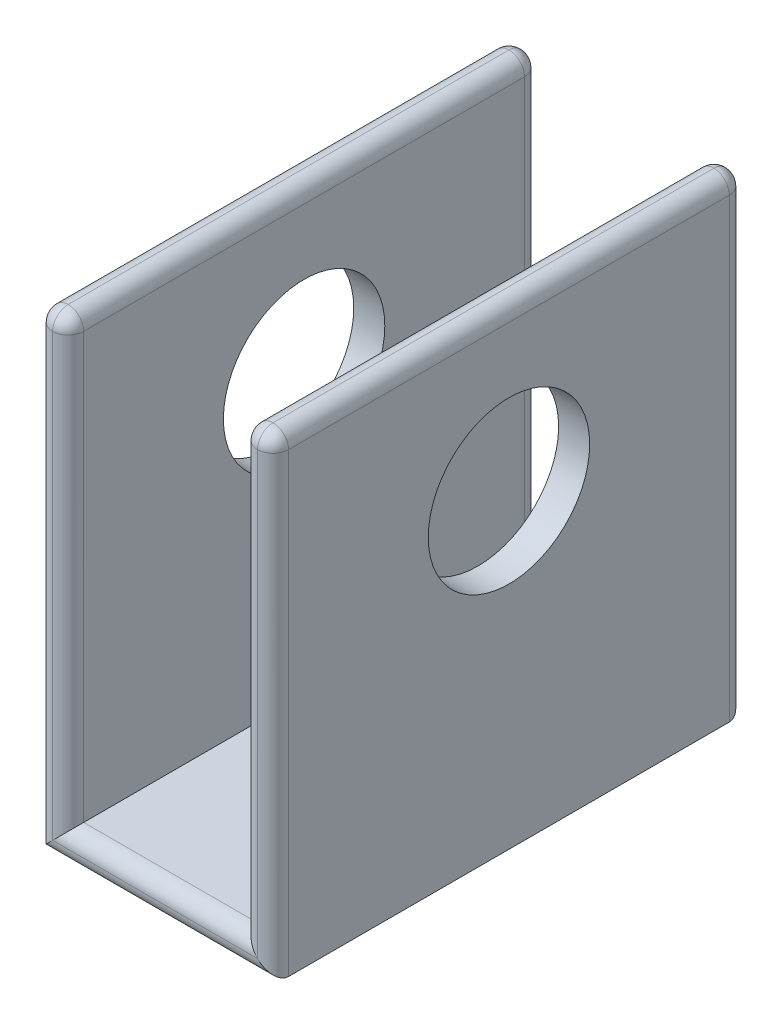
ISO-10303-21;
HEADER;
FILE_DESCRIPTION(('STEP AP214'),'2;1');
FILE_NAME('part.step','',(''),(''),'','','');
FILE_SCHEMA(('AUTOMOTIVE_DESIGN { 1 0 10303 214 1 1 1 1 }'));
ENDSEC;
DATA;
#1=APPLICATION_CONTEXT('core data for automotive mechanical design processes');
#2=APPLICATION_PROTOCOL_DEFINITION('international standard','automotive_design',2000,#1);
#3=PRODUCT_CONTEXT('',#1,'mechanical');
#4=PRODUCT('Part','Part','',(#3));
#5=PRODUCT_RELATED_PRODUCT_CATEGORY('part','',(#4));
#6=PRODUCT_DEFINITION_FORMATION('','',#4);
#7=PRODUCT_DEFINITION_CONTEXT('part definition',#1,'design');
#8=PRODUCT_DEFINITION('design','',#6,#7);
#9=PRODUCT_DEFINITION_SHAPE('','',#8);
#10=(LENGTH_UNIT() NAMED_UNIT(*) SI_UNIT(.MILLI.,.METRE.));
#11=(NAMED_UNIT(*) PLANE_ANGLE_UNIT() SI_UNIT($,.RADIAN.));
#12=(NAMED_UNIT(*) SI_UNIT($,.STERADIAN.) SOLID_ANGLE_UNIT());
#13=UNCERTAINTY_MEASURE_WITH_UNIT(LENGTH_MEASURE(1.E-05),#10,'distance_accuracy_value','');
#14=(GEOMETRIC_REPRESENTATION_CONTEXT(3) GLOBAL_UNCERTAINTY_ASSIGNED_CONTEXT((#13)) GLOBAL_UNIT_ASSIGNED_CONTEXT((#10,
#11,#12)) REPRESENTATION_CONTEXT('',''));
#15=CARTESIAN_POINT('',(0.,0.,0.));
#16=DIRECTION('',(0.,0.,1.));
#17=DIRECTION('',(1.,0.,0.));
#18=AXIS2_PLACEMENT_3D('',#15,#16,#17);
#19=CARTESIAN_POINT('',(8.25,36.75,38.));
#20=DIRECTION('',(0.,0.,-1.));
#21=DIRECTION('',(-1.,0.,0.));
#22=AXIS2_PLACEMENT_3D('',#19,#20,#21);
#23=CYLINDRICAL_SURFACE('',#22,1.25);
#24=DIRECTION('',(0.,0.,-1.));
#25=VECTOR('',#24,1.);
#26=CARTESIAN_POINT('',(8.25000000000001,38.,38.));
#27=LINE('',#26,#25);
#28=CARTESIAN_POINT('',(8.25000000000001,38.,36.75));
#29=VERTEX_POINT('',#28);
#30=CARTESIAN_POINT('',(8.25000000000001,38.,1.25));
#31=VERTEX_POINT('',#30);
#32=EDGE_CURVE('E282',#29,#31,#27,.T.);
#33=ORIENTED_EDGE('',*,*,#32,.T.);
#34=CARTESIAN_POINT('',(8.25,36.75,1.25));
#35=DIRECTION('',(0.,0.,-1.));
#36=DIRECTION('',(-1.,0.,0.));
#37=AXIS2_PLACEMENT_3D('',#34,#35,#36);
#38=CIRCLE('',#37,1.25);
#39=CARTESIAN_POINT('',(7.,36.75,1.25));
#40=VERTEX_POINT('',#39);
#41=EDGE_CURVE('E307',#31,#40,#38,.F.);
#42=ORIENTED_EDGE('',*,*,#41,.T.);
#43=DIRECTION('',(0.,0.,-1.));
#44=VECTOR('',#43,1.);
#45=CARTESIAN_POINT('',(7.,36.75,38.));
#46=LINE('',#45,#44);
#47=CARTESIAN_POINT('',(7.,36.75,36.75));
#48=VERTEX_POINT('',#47);
#49=EDGE_CURVE('E283',#48,#40,#46,.T.);
#50=ORIENTED_EDGE('',*,*,#49,.F.);
#51=CARTESIAN_POINT('',(8.25,36.75,36.75));
#52=DIRECTION('',(0.,0.,-1.));
#53=DIRECTION('',(-1.,0.,0.));
#54=AXIS2_PLACEMENT_3D('',#51,#52,#53);
#55=CIRCLE('',#54,1.25);
#56=EDGE_CURVE('E286',#48,#29,#55,.T.);
#57=ORIENTED_EDGE('',*,*,#56,.T.);
#58=EDGE_LOOP('',(#33,#42,#50,#57));
#59=FACE_BOUND('',#58,.T.);
#60=ADVANCED_FACE('F45',(#59),#23,.T.);
#61=CARTESIAN_POINT('',(7.,2.5,38.));
#62=DIRECTION('',(-1.,0.,0.));
#63=DIRECTION('',(0.,-1.,0.));
#64=AXIS2_PLACEMENT_3D('',#61,#62,#63);
#65=PLANE('',#64);
#66=CARTESIAN_POINT('',(7.,25.,19.));
#67=DIRECTION('',(-1.,0.,0.));
#68=DIRECTION('',(0.,-1.,0.));
#69=AXIS2_PLACEMENT_3D('',#66,#67,#68);
#70=CIRCLE('',#69,6.5);
#71=CARTESIAN_POINT('',(7.,18.5,19.));
#72=VERTEX_POINT('',#71);
#73=EDGE_CURVE('E278',#72,#72,#70,.T.);
#74=ORIENTED_EDGE('',*,*,#73,.F.);
#75=EDGE_LOOP('',(#74));
#76=FACE_BOUND('',#75,.T.);
#77=DIRECTION('',(0.,0.,-1.));
#78=VECTOR('',#77,1.);
#79=CARTESIAN_POINT('',(7.,2.5,38.));
#80=LINE('',#79,#78);
#81=CARTESIAN_POINT('',(7.,2.5,36.75));
#82=VERTEX_POINT('',#81);
#83=CARTESIAN_POINT('',(7.,2.5,1.25));
#84=VERTEX_POINT('',#83);
#85=EDGE_CURVE('E161',#82,#84,#80,.T.);
#86=ORIENTED_EDGE('',*,*,#85,.F.);
#87=DIRECTION('',(0.,1.,0.));
#88=VECTOR('',#87,1.);
#89=CARTESIAN_POINT('',(7.,36.75,36.75));
#90=LINE('',#89,#88);
#91=EDGE_CURVE('E11',#82,#48,#90,.T.);
#92=ORIENTED_EDGE('',*,*,#91,.T.);
#93=ORIENTED_EDGE('',*,*,#49,.T.);
#94=DIRECTION('',(0.,1.,0.));
#95=VECTOR('',#94,1.);
#96=CARTESIAN_POINT('',(7.,2.5,1.25));
#97=LINE('',#96,#95);
#98=EDGE_CURVE('E56',#40,#84,#97,.F.);
#99=ORIENTED_EDGE('',*,*,#98,.T.);
#100=EDGE_LOOP('',(#86,#92,#93,#99));
#101=FACE_BOUND('',#100,.T.);
#102=ADVANCED_FACE('F403',(#76,#101),#65,.T.);
#103=CARTESIAN_POINT('',(-7.,2.5,38.));
#104=DIRECTION('',(0.,1.,0.));
#105=DIRECTION('',(0.,0.,1.));
#106=AXIS2_PLACEMENT_3D('',#103,#104,#105);
#107=PLANE('',#106);
#108=DIRECTION('',(0.,0.,-1.));
#109=VECTOR('',#108,1.);
#110=CARTESIAN_POINT('',(-7.,2.5,38.));
#111=LINE('',#110,#109);
#112=CARTESIAN_POINT('',(-7.,2.5,36.75));
#113=VERTEX_POINT('',#112);
#114=CARTESIAN_POINT('',(-7.,2.5,1.25));
#115=VERTEX_POINT('',#114);
#116=EDGE_CURVE('E160',#113,#115,#111,.T.);
#117=ORIENTED_EDGE('',*,*,#116,.F.);
#118=DIRECTION('',(1.,0.,0.));
#119=VECTOR('',#118,1.);
#120=CARTESIAN_POINT('',(7.,2.5,36.75));
#121=LINE('',#120,#119);
#122=EDGE_CURVE('E167',#113,#82,#121,.T.);
#123=ORIENTED_EDGE('',*,*,#122,.T.);
#124=ORIENTED_EDGE('',*,*,#85,.T.);
#125=DIRECTION('',(1.,0.,0.));
#126=VECTOR('',#125,1.);
#127=CARTESIAN_POINT('',(-7.,2.5,1.25));
#128=LINE('',#127,#126);
#129=EDGE_CURVE('E157',#84,#115,#128,.F.);
#130=ORIENTED_EDGE('',*,*,#129,.T.);
#131=EDGE_LOOP('',(#117,#123,#124,#130));
#132=FACE_BOUND('',#131,.T.);
#133=ADVANCED_FACE('F159',(#132),#107,.T.);
#134=CARTESIAN_POINT('',(-7.,2.5,38.));
#135=DIRECTION('',(-1.,0.,0.));
#136=DIRECTION('',(0.,0.,1.));
#137=AXIS2_PLACEMENT_3D('',#134,#135,#136);
#138=PLANE('',#137);
#139=CARTESIAN_POINT('',(-7.,25.,19.));
#140=DIRECTION('',(-1.,0.,0.));
#141=DIRECTION('',(0.,0.,1.));
#142=AXIS2_PLACEMENT_3D('',#139,#140,#141);
#143=CIRCLE('',#142,6.5);
#144=CARTESIAN_POINT('',(-7.,25.,25.5));
#145=VERTEX_POINT('',#144);
#146=EDGE_CURVE('E272',#145,#145,#143,.T.);
#147=ORIENTED_EDGE('',*,*,#146,.T.);
#148=EDGE_LOOP('',(#147));
#149=FACE_BOUND('',#148,.T.);
#150=DIRECTION('',(0.,0.,-1.));
#151=VECTOR('',#150,1.);
#152=CARTESIAN_POINT('',(-7.,36.75,38.));
#153=LINE('',#152,#151);
#154=CARTESIAN_POINT('',(-7.,36.75,36.75));
#155=VERTEX_POINT('',#154);
#156=CARTESIAN_POINT('',(-7.,36.75,1.25));
#157=VERTEX_POINT('',#156);
#158=EDGE_CURVE('E178',#155,#157,#153,.T.);
#159=ORIENTED_EDGE('',*,*,#158,.F.);
#160=DIRECTION('',(0.,1.,0.));
#161=VECTOR('',#160,1.);
#162=CARTESIAN_POINT('',(-7.,2.5,36.75));
#163=LINE('',#162,#161);
#164=EDGE_CURVE('E168',#155,#113,#163,.F.);
#165=ORIENTED_EDGE('',*,*,#164,.T.);
#166=ORIENTED_EDGE('',*,*,#116,.T.);
#167=DIRECTION('',(0.,1.,0.));
#168=VECTOR('',#167,1.);
#169=CARTESIAN_POINT('',(-7.,36.75,1.25));
#170=LINE('',#169,#168);
#171=EDGE_CURVE('E174',#115,#157,#170,.T.);
#172=ORIENTED_EDGE('',*,*,#171,.T.);
#173=EDGE_LOOP('',(#159,#165,#166,#172));
#174=FACE_BOUND('',#173,.T.);
#175=ADVANCED_FACE('F173',(#149,#174),#138,.F.);
#176=CARTESIAN_POINT('',(-8.25,36.75,38.));
#177=DIRECTION('',(0.,0.,-1.));
#178=DIRECTION('',(-1.,0.,0.));
#179=AXIS2_PLACEMENT_3D('',#176,#177,#178);
#180=CYLINDRICAL_SURFACE('',#179,1.25);
#181=ORIENTED_EDGE('',*,*,#158,.T.);
#182=CARTESIAN_POINT('',(-8.25,36.75,1.25));
#183=DIRECTION('',(0.,0.,-1.));
#184=DIRECTION('',(-1.,0.,0.));
#185=AXIS2_PLACEMENT_3D('',#182,#183,#184);
#186=CIRCLE('',#185,1.25);
#187=CARTESIAN_POINT('',(-8.25000000000001,38.,1.25));
#188=VERTEX_POINT('',#187);
#189=EDGE_CURVE('E314',#157,#188,#186,.F.);
#190=ORIENTED_EDGE('',*,*,#189,.T.);
#191=DIRECTION('',(0.,0.,-1.));
#192=VECTOR('',#191,1.);
#193=CARTESIAN_POINT('',(-8.25000000000001,38.,38.));
#194=LINE('',#193,#192);
#195=CARTESIAN_POINT('',(-8.25000000000001,38.,36.75));
#196=VERTEX_POINT('',#195);
#197=EDGE_CURVE('E291',#196,#188,#194,.T.);
#198=ORIENTED_EDGE('',*,*,#197,.F.);
#199=CARTESIAN_POINT('',(-8.25,36.75,36.75));
#200=DIRECTION('',(0.,0.,-1.));
#201=DIRECTION('',(-1.,0.,0.));
#202=AXIS2_PLACEMENT_3D('',#199,#200,#201);
#203=CIRCLE('',#202,1.25);
#204=EDGE_CURVE('E311',#196,#155,#203,.T.);
#205=ORIENTED_EDGE('',*,*,#204,.T.);
#206=EDGE_LOOP('',(#181,#190,#198,#205));
#207=FACE_BOUND('',#206,.T.);
#208=ADVANCED_FACE('F396',(#207),#180,.T.);
#209=CARTESIAN_POINT('',(-9.5,0.,38.));
#210=DIRECTION('',(-1.,0.,0.));
#211=DIRECTION('',(0.,0.,1.));
#212=AXIS2_PLACEMENT_3D('',#209,#210,#211);
#213=PLANE('',#212);
#214=DIRECTION('',(0.,0.,-1.));
#215=VECTOR('',#214,1.);
#216=CARTESIAN_POINT('',(-9.5,0.,38.));
#217=LINE('',#216,#215);
#218=CARTESIAN_POINT('',(-9.5,0.,36.75));
#219=VERTEX_POINT('',#218);
#220=CARTESIAN_POINT('',(-9.5,0.,1.25));
#221=VERTEX_POINT('',#220);
#222=EDGE_CURVE('E295',#219,#221,#217,.T.);
#223=ORIENTED_EDGE('',*,*,#222,.F.);
#224=DIRECTION('',(0.,1.,0.));
#225=VECTOR('',#224,1.);
#226=CARTESIAN_POINT('',(-9.5,38.,36.75));
#227=LINE('',#226,#225);
#228=CARTESIAN_POINT('',(-9.5,36.75,36.75));
#229=VERTEX_POINT('',#228);
#230=EDGE_CURVE('E190',#219,#229,#227,.T.);
#231=ORIENTED_EDGE('',*,*,#230,.T.);
#232=DIRECTION('',(0.,0.,-1.));
#233=VECTOR('',#232,1.);
#234=CARTESIAN_POINT('',(-9.5,36.75,38.));
#235=LINE('',#234,#233);
#236=CARTESIAN_POINT('',(-9.5,36.75,1.25));
#237=VERTEX_POINT('',#236);
#238=EDGE_CURVE('E333',#229,#237,#235,.T.);
#239=ORIENTED_EDGE('',*,*,#238,.T.);
#240=DIRECTION('',(0.,1.,0.));
#241=VECTOR('',#240,1.);
#242=CARTESIAN_POINT('',(-9.5,0.,1.25));
#243=LINE('',#242,#241);
#244=EDGE_CURVE('E336',#237,#221,#243,.F.);
#245=ORIENTED_EDGE('',*,*,#244,.T.);
#246=EDGE_LOOP('',(#223,#231,#239,#245));
#247=FACE_BOUND('',#246,.T.);
#248=CARTESIAN_POINT('',(-9.5,25.,19.));
#249=DIRECTION('',(1.,0.,0.));
#250=DIRECTION('',(0.,0.,-1.));
#251=AXIS2_PLACEMENT_3D('',#248,#249,#250);
#252=CIRCLE('',#251,6.5);
#253=CARTESIAN_POINT('',(-9.5,25.,12.5));
#254=VERTEX_POINT('',#253);
#255=EDGE_CURVE('E266',#254,#254,#252,.T.);
#256=ORIENTED_EDGE('',*,*,#255,.T.);
#257=EDGE_LOOP('',(#256));
#258=FACE_BOUND('',#257,.T.);
#259=ADVANCED_FACE('F423',(#247,#258),#213,.T.);
#260=CARTESIAN_POINT('',(-9.5,0.,38.));
#261=DIRECTION('',(0.,1.,0.));
#262=DIRECTION('',(0.,0.,1.));
#263=AXIS2_PLACEMENT_3D('',#260,#261,#262);
#264=PLANE('',#263);
#265=DIRECTION('',(0.,0.,-1.));
#266=VECTOR('',#265,1.);
#267=CARTESIAN_POINT('',(9.5,0.,38.));
#268=LINE('',#267,#266);
#269=CARTESIAN_POINT('',(9.5,0.,36.75));
#270=VERTEX_POINT('',#269);
#271=CARTESIAN_POINT('',(9.5,0.,1.25));
#272=VERTEX_POINT('',#271);
#273=EDGE_CURVE('E299',#270,#272,#268,.T.);
#274=ORIENTED_EDGE('',*,*,#273,.F.);
#275=DIRECTION('',(1.,0.,0.));
#276=VECTOR('',#275,1.);
#277=CARTESIAN_POINT('',(-9.5,0.,36.75));
#278=LINE('',#277,#276);
#279=EDGE_CURVE('E330',#270,#219,#278,.F.);
#280=ORIENTED_EDGE('',*,*,#279,.T.);
#281=ORIENTED_EDGE('',*,*,#222,.T.);
#282=DIRECTION('',(1.,0.,0.));
#283=VECTOR('',#282,1.);
#284=CARTESIAN_POINT('',(9.5,0.,1.25));
#285=LINE('',#284,#283);
#286=EDGE_CURVE('E327',#221,#272,#285,.T.);
#287=ORIENTED_EDGE('',*,*,#286,.T.);
#288=EDGE_LOOP('',(#274,#280,#281,#287));
#289=FACE_BOUND('',#288,.T.);
#290=ADVANCED_FACE('F426',(#289),#264,.F.);
#291=CARTESIAN_POINT('',(9.5,0.,38.));
#292=DIRECTION('',(-1.,0.,0.));
#293=DIRECTION('',(0.,0.,1.));
#294=AXIS2_PLACEMENT_3D('',#291,#292,#293);
#295=PLANE('',#294);
#296=CARTESIAN_POINT('',(9.5,25.,19.));
#297=DIRECTION('',(1.,0.,0.));
#298=DIRECTION('',(0.,0.,-1.));
#299=AXIS2_PLACEMENT_3D('',#296,#297,#298);
#300=CIRCLE('',#299,6.5);
#301=CARTESIAN_POINT('',(9.5,25.,12.5));
#302=VERTEX_POINT('',#301);
#303=EDGE_CURVE('E261',#302,#302,#300,.T.);
#304=ORIENTED_EDGE('',*,*,#303,.F.);
#305=EDGE_LOOP('',(#304));
#306=FACE_BOUND('',#305,.T.);
#307=DIRECTION('',(0.,0.,-1.));
#308=VECTOR('',#307,1.);
#309=CARTESIAN_POINT('',(9.5,36.75,38.));
#310=LINE('',#309,#308);
#311=CARTESIAN_POINT('',(9.5,36.75,1.25));
#312=VERTEX_POINT('',#311);
#313=CARTESIAN_POINT('',(9.5,36.75,36.75));
#314=VERTEX_POINT('',#313);
#315=EDGE_CURVE('E317',#312,#314,#310,.F.);
#316=ORIENTED_EDGE('',*,*,#315,.T.);
#317=DIRECTION('',(0.,1.,0.));
#318=VECTOR('',#317,1.);
#319=CARTESIAN_POINT('',(9.5,0.,36.75));
#320=LINE('',#319,#318);
#321=EDGE_CURVE('E323',#314,#270,#320,.F.);
#322=ORIENTED_EDGE('',*,*,#321,.T.);
#323=ORIENTED_EDGE('',*,*,#273,.T.);
#324=DIRECTION('',(0.,1.,0.));
#325=VECTOR('',#324,1.);
#326=CARTESIAN_POINT('',(9.5,38.,1.25));
#327=LINE('',#326,#325);
#328=EDGE_CURVE('E320',#272,#312,#327,.T.);
#329=ORIENTED_EDGE('',*,*,#328,.T.);
#330=EDGE_LOOP('',(#316,#322,#323,#329));
#331=FACE_BOUND('',#330,.T.);
#332=ADVANCED_FACE('F430',(#306,#331),#295,.F.);
#333=CARTESIAN_POINT('',(-9.5,25.,19.));
#334=DIRECTION('',(1.,0.,0.));
#335=DIRECTION('',(0.,0.,-1.));
#336=AXIS2_PLACEMENT_3D('',#333,#334,#335);
#337=CYLINDRICAL_SURFACE('',#336,6.5);
#338=ORIENTED_EDGE('',*,*,#73,.T.);
#339=EDGE_LOOP('',(#338));
#340=FACE_BOUND('',#339,.T.);
#341=ORIENTED_EDGE('',*,*,#303,.T.);
#342=EDGE_LOOP('',(#341));
#343=FACE_BOUND('',#342,.T.);
#344=ADVANCED_FACE('F416',(#340,#343),#337,.F.);
#345=ORIENTED_EDGE('',*,*,#255,.F.);
#346=EDGE_LOOP('',(#345));
#347=FACE_BOUND('',#346,.T.);
#348=ORIENTED_EDGE('',*,*,#146,.F.);
#349=EDGE_LOOP('',(#348));
#350=FACE_BOUND('',#349,.T.);
#351=ADVANCED_FACE('F503',(#347,#350),#337,.F.);
#352=CARTESIAN_POINT('',(-8.25,36.75,36.75));
#353=DIRECTION('',(0.,0.,-1.));
#354=DIRECTION('',(-1.,0.,0.));
#355=AXIS2_PLACEMENT_3D('',#352,#353,#354);
#356=SPHERICAL_SURFACE('',#355,1.25);
#357=ORIENTED_EDGE('',*,*,#204,.F.);
#358=CARTESIAN_POINT('',(-8.25,36.75,36.75));
#359=DIRECTION('',(-1.,0.,0.));
#360=DIRECTION('',(0.,0.,1.));
#361=AXIS2_PLACEMENT_3D('',#358,#359,#360);
#362=CIRCLE('',#361,1.25);
#363=CARTESIAN_POINT('',(-8.25,36.75,38.));
#364=VERTEX_POINT('',#363);
#365=EDGE_CURVE('E49',#364,#196,#362,.T.);
#366=ORIENTED_EDGE('',*,*,#365,.F.);
#367=CARTESIAN_POINT('',(-8.25,36.75,36.75));
#368=DIRECTION('',(0.,-1.,0.));
#369=DIRECTION('',(1.,0.,0.));
#370=AXIS2_PLACEMENT_3D('',#367,#368,#369);
#371=CIRCLE('',#370,1.25);
#372=EDGE_CURVE('E257',#155,#364,#371,.T.);
#373=ORIENTED_EDGE('',*,*,#372,.F.);
#374=EDGE_LOOP('',(#357,#366,#373));
#375=FACE_BOUND('',#374,.T.);
#376=ADVANCED_FACE('F47',(#375),#356,.T.);
#377=CARTESIAN_POINT('',(-8.25,36.75,36.75));
#378=DIRECTION('',(0.,1.,0.));
#379=DIRECTION('',(0.,0.,1.));
#380=AXIS2_PLACEMENT_3D('',#377,#378,#379);
#381=SPHERICAL_SURFACE('',#380,1.25);
#382=CARTESIAN_POINT('',(-8.25,36.75,36.75));
#383=DIRECTION('',(0.,1.,0.));
#384=DIRECTION('',(0.,0.,1.));
#385=AXIS2_PLACEMENT_3D('',#382,#383,#384);
#386=CIRCLE('',#385,1.25);
#387=EDGE_CURVE('E250',#364,#229,#386,.F.);
#388=ORIENTED_EDGE('',*,*,#387,.F.);
#389=ORIENTED_EDGE('',*,*,#365,.T.);
#390=CARTESIAN_POINT('',(-8.25,36.75,36.75));
#391=DIRECTION('',(0.,0.,1.));
#392=DIRECTION('',(1.,0.,0.));
#393=AXIS2_PLACEMENT_3D('',#390,#391,#392);
#394=CIRCLE('',#393,1.25);
#395=EDGE_CURVE('E254',#229,#196,#394,.F.);
#396=ORIENTED_EDGE('',*,*,#395,.F.);
#397=EDGE_LOOP('',(#388,#389,#396));
#398=FACE_BOUND('',#397,.T.);
#399=ADVANCED_FACE('F498',(#398),#381,.T.);
#400=CARTESIAN_POINT('',(-8.25,36.75,36.75));
#401=DIRECTION('',(0.,1.,0.));
#402=DIRECTION('',(0.,0.,1.));
#403=AXIS2_PLACEMENT_3D('',#400,#401,#402);
#404=CYLINDRICAL_SURFACE('',#403,1.25);
#405=ORIENTED_EDGE('',*,*,#164,.F.);
#406=ORIENTED_EDGE('',*,*,#372,.T.);
#407=DIRECTION('',(0.,1.,0.));
#408=VECTOR('',#407,1.);
#409=CARTESIAN_POINT('',(-8.25,36.75,38.));
#410=LINE('',#409,#408);
#411=CARTESIAN_POINT('',(-8.25,1.25,38.));
#412=VERTEX_POINT('',#411);
#413=EDGE_CURVE('E94',#412,#364,#410,.T.);
#414=ORIENTED_EDGE('',*,*,#413,.F.);
#415=CARTESIAN_POINT('',(-8.25,1.25,36.75));
#416=DIRECTION('',(-0.707106781186547,0.707106781186547,0.));
#417=DIRECTION('',(0.707106781186547,0.707106781186547,0.));
#418=AXIS2_PLACEMENT_3D('',#415,#416,#417);
#419=ELLIPSE('',#418,1.76776695296637,1.25);
#420=EDGE_CURVE('E245',#113,#412,#419,.F.);
#421=ORIENTED_EDGE('',*,*,#420,.F.);
#422=EDGE_LOOP('',(#405,#406,#414,#421));
#423=FACE_BOUND('',#422,.T.);
#424=ADVANCED_FACE('F397',(#423),#404,.T.);
#425=CARTESIAN_POINT('',(-8.25,36.75,38.));
#426=DIRECTION('',(0.,0.,-1.));
#427=DIRECTION('',(-1.,0.,0.));
#428=AXIS2_PLACEMENT_3D('',#425,#426,#427);
#429=CYLINDRICAL_SURFACE('',#428,1.25);
#430=ORIENTED_EDGE('',*,*,#395,.T.);
#431=ORIENTED_EDGE('',*,*,#197,.T.);
#432=CARTESIAN_POINT('',(-8.25,36.75,1.25));
#433=DIRECTION('',(0.,0.,-1.));
#434=DIRECTION('',(-1.,0.,0.));
#435=AXIS2_PLACEMENT_3D('',#432,#433,#434);
#436=CIRCLE('',#435,1.25);
#437=EDGE_CURVE('E237',#237,#188,#436,.T.);
#438=ORIENTED_EDGE('',*,*,#437,.F.);
#439=ORIENTED_EDGE('',*,*,#238,.F.);
#440=EDGE_LOOP('',(#430,#431,#438,#439));
#441=FACE_BOUND('',#440,.T.);
#442=ADVANCED_FACE('F492',(#441),#429,.T.);
#443=CARTESIAN_POINT('',(-8.25,0.,36.75));
#444=DIRECTION('',(0.,-1.,0.));
#445=DIRECTION('',(0.,0.,-1.));
#446=AXIS2_PLACEMENT_3D('',#443,#444,#445);
#447=CYLINDRICAL_SURFACE('',#446,1.25);
#448=ORIENTED_EDGE('',*,*,#387,.T.);
#449=ORIENTED_EDGE('',*,*,#230,.F.);
#450=CARTESIAN_POINT('',(-8.25,1.25,36.75));
#451=DIRECTION('',(0.707106781186547,-0.707106781186547,0.));
#452=DIRECTION('',(-0.707106781186547,-0.707106781186547,0.));
#453=AXIS2_PLACEMENT_3D('',#450,#451,#452);
#454=ELLIPSE('',#453,1.76776695296637,1.25);
#455=EDGE_CURVE('E233',#412,#219,#454,.T.);
#456=ORIENTED_EDGE('',*,*,#455,.F.);
#457=ORIENTED_EDGE('',*,*,#413,.T.);
#458=EDGE_LOOP('',(#448,#449,#456,#457));
#459=FACE_BOUND('',#458,.T.);
#460=ADVANCED_FACE('F489',(#459),#447,.T.);
#461=CARTESIAN_POINT('',(-7.,1.25,36.75));
#462=DIRECTION('',(-1.,0.,0.));
#463=DIRECTION('',(0.,0.,1.));
#464=AXIS2_PLACEMENT_3D('',#461,#462,#463);
#465=CYLINDRICAL_SURFACE('',#464,1.25);
#466=ORIENTED_EDGE('',*,*,#122,.F.);
#467=ORIENTED_EDGE('',*,*,#420,.T.);
#468=DIRECTION('',(1.,0.,0.));
#469=VECTOR('',#468,1.);
#470=CARTESIAN_POINT('',(-7.,1.25,38.));
#471=LINE('',#470,#469);
#472=CARTESIAN_POINT('',(8.25,1.25,38.));
#473=VERTEX_POINT('',#472);
#474=EDGE_CURVE('E229',#473,#412,#471,.F.);
#475=ORIENTED_EDGE('',*,*,#474,.F.);
#476=CARTESIAN_POINT('',(8.25,1.25,36.75));
#477=DIRECTION('',(-0.707106781186547,-0.707106781186547,0.));
#478=DIRECTION('',(-0.707106781186547,0.707106781186547,0.));
#479=AXIS2_PLACEMENT_3D('',#476,#477,#478);
#480=ELLIPSE('',#479,1.76776695296637,1.25);
#481=EDGE_CURVE('E225',#82,#473,#480,.F.);
#482=ORIENTED_EDGE('',*,*,#481,.F.);
#483=EDGE_LOOP('',(#466,#467,#475,#482));
#484=FACE_BOUND('',#483,.T.);
#485=ADVANCED_FACE('F402',(#484),#465,.T.);
#486=CARTESIAN_POINT('',(-8.25,36.75,1.25));
#487=DIRECTION('',(0.,0.,-1.));
#488=DIRECTION('',(-1.,0.,0.));
#489=AXIS2_PLACEMENT_3D('',#486,#487,#488);
#490=SPHERICAL_SURFACE('',#489,1.25);
#491=CARTESIAN_POINT('',(-8.25000000000001,36.75,1.25));
#492=DIRECTION('',(1.,0.,0.));
#493=DIRECTION('',(0.,0.,-1.));
#494=AXIS2_PLACEMENT_3D('',#491,#492,#493);
#495=CIRCLE('',#494,1.25);
#496=CARTESIAN_POINT('',(-8.25,36.75,0.));
#497=VERTEX_POINT('',#496);
#498=EDGE_CURVE('E241',#497,#188,#495,.T.);
#499=ORIENTED_EDGE('',*,*,#498,.T.);
#500=ORIENTED_EDGE('',*,*,#189,.F.);
#501=CARTESIAN_POINT('',(-8.25,36.75,1.25));
#502=DIRECTION('',(0.,-1.,0.));
#503=DIRECTION('',(1.,0.,0.));
#504=AXIS2_PLACEMENT_3D('',#501,#502,#503);
#505=CIRCLE('',#504,1.25);
#506=EDGE_CURVE('E188',#497,#157,#505,.T.);
#507=ORIENTED_EDGE('',*,*,#506,.F.);
#508=EDGE_LOOP('',(#499,#500,#507));
#509=FACE_BOUND('',#508,.T.);
#510=ADVANCED_FACE('F394',(#509),#490,.T.);
#511=CARTESIAN_POINT('',(-8.25,36.75,1.25));
#512=DIRECTION('',(0.,1.,0.));
#513=DIRECTION('',(0.,0.,1.));
#514=AXIS2_PLACEMENT_3D('',#511,#512,#513);
#515=SPHERICAL_SURFACE('',#514,1.25);
#516=ORIENTED_EDGE('',*,*,#437,.T.);
#517=ORIENTED_EDGE('',*,*,#498,.F.);
#518=CARTESIAN_POINT('',(-8.25,36.75,1.25));
#519=DIRECTION('',(0.,1.,0.));
#520=DIRECTION('',(0.,0.,1.));
#521=AXIS2_PLACEMENT_3D('',#518,#519,#520);
#522=CIRCLE('',#521,1.25);
#523=EDGE_CURVE('E213',#237,#497,#522,.F.);
#524=ORIENTED_EDGE('',*,*,#523,.F.);
#525=EDGE_LOOP('',(#516,#517,#524));
#526=FACE_BOUND('',#525,.T.);
#527=ADVANCED_FACE('F390',(#526),#515,.T.);
#528=CARTESIAN_POINT('',(8.25,1.25,36.75));
#529=DIRECTION('',(1.,0.,0.));
#530=DIRECTION('',(0.,0.,-1.));
#531=AXIS2_PLACEMENT_3D('',#528,#529,#530);
#532=CYLINDRICAL_SURFACE('',#531,1.25);
#533=ORIENTED_EDGE('',*,*,#455,.T.);
#534=ORIENTED_EDGE('',*,*,#279,.F.);
#535=CARTESIAN_POINT('',(8.25,1.25,36.75));
#536=DIRECTION('',(0.707106781186547,0.707106781186547,0.));
#537=DIRECTION('',(0.707106781186547,-0.707106781186547,0.));
#538=AXIS2_PLACEMENT_3D('',#535,#536,#537);
#539=ELLIPSE('',#538,1.76776695296637,1.25);
#540=EDGE_CURVE('E210',#473,#270,#539,.T.);
#541=ORIENTED_EDGE('',*,*,#540,.F.);
#542=ORIENTED_EDGE('',*,*,#474,.T.);
#543=EDGE_LOOP('',(#533,#534,#541,#542));
#544=FACE_BOUND('',#543,.T.);
#545=ADVANCED_FACE('F478',(#544),#532,.T.);
#546=CARTESIAN_POINT('',(8.25,2.5,36.75));
#547=DIRECTION('',(0.,-1.,0.));
#548=DIRECTION('',(1.,0.,0.));
#549=AXIS2_PLACEMENT_3D('',#546,#547,#548);
#550=CYLINDRICAL_SURFACE('',#549,1.25);
#551=CARTESIAN_POINT('',(8.25,36.75,36.75));
#552=DIRECTION('',(0.,1.,0.));
#553=DIRECTION('',(0.,0.,1.));
#554=AXIS2_PLACEMENT_3D('',#551,#552,#553);
#555=CIRCLE('',#554,1.25);
#556=CARTESIAN_POINT('',(8.25,36.75,38.));
#557=VERTEX_POINT('',#556);
#558=EDGE_CURVE('E222',#48,#557,#555,.T.);
#559=ORIENTED_EDGE('',*,*,#558,.F.);
#560=ORIENTED_EDGE('',*,*,#91,.F.);
#561=ORIENTED_EDGE('',*,*,#481,.T.);
#562=DIRECTION('',(0.,1.,0.));
#563=VECTOR('',#562,1.);
#564=CARTESIAN_POINT('',(8.25,2.5,38.));
#565=LINE('',#564,#563);
#566=EDGE_CURVE('E201',#557,#473,#565,.F.);
#567=ORIENTED_EDGE('',*,*,#566,.F.);
#568=EDGE_LOOP('',(#559,#560,#561,#567));
#569=FACE_BOUND('',#568,.T.);
#570=ADVANCED_FACE('F474',(#569),#550,.T.);
#571=CARTESIAN_POINT('',(8.25,36.75,36.75));
#572=DIRECTION('',(0.,0.,-1.));
#573=DIRECTION('',(-1.,0.,0.));
#574=AXIS2_PLACEMENT_3D('',#571,#572,#573);
#575=SPHERICAL_SURFACE('',#574,1.25);
#576=ORIENTED_EDGE('',*,*,#56,.F.);
#577=ORIENTED_EDGE('',*,*,#558,.T.);
#578=CARTESIAN_POINT('',(8.25,36.75,36.75));
#579=DIRECTION('',(1.,0.,0.));
#580=DIRECTION('',(0.,1.,0.));
#581=AXIS2_PLACEMENT_3D('',#578,#579,#580);
#582=CIRCLE('',#581,1.25);
#583=EDGE_CURVE('E196',#29,#557,#582,.T.);
#584=ORIENTED_EDGE('',*,*,#583,.F.);
#585=EDGE_LOOP('',(#576,#577,#584));
#586=FACE_BOUND('',#585,.T.);
#587=ADVANCED_FACE('F471',(#586),#575,.T.);
#588=CARTESIAN_POINT('',(-8.25,2.5,1.25));
#589=DIRECTION('',(0.,-1.,0.));
#590=DIRECTION('',(0.,0.,-1.));
#591=AXIS2_PLACEMENT_3D('',#588,#589,#590);
#592=CYLINDRICAL_SURFACE('',#591,1.25);
#593=DIRECTION('',(0.,1.,0.));
#594=VECTOR('',#593,1.);
#595=CARTESIAN_POINT('',(-8.25,2.5,0.));
#596=LINE('',#595,#594);
#597=CARTESIAN_POINT('',(-8.25,1.25,0.));
#598=VERTEX_POINT('',#597);
#599=EDGE_CURVE('E217',#497,#598,#596,.F.);
#600=ORIENTED_EDGE('',*,*,#599,.F.);
#601=ORIENTED_EDGE('',*,*,#506,.T.);
#602=ORIENTED_EDGE('',*,*,#171,.F.);
#603=CARTESIAN_POINT('',(-8.25,1.25,1.25));
#604=DIRECTION('',(0.707106781186547,-0.707106781186547,0.));
#605=DIRECTION('',(0.707106781186547,0.707106781186547,0.));
#606=AXIS2_PLACEMENT_3D('',#603,#604,#605);
#607=ELLIPSE('',#606,1.76776695296637,1.25);
#608=EDGE_CURVE('E185',#598,#115,#607,.T.);
#609=ORIENTED_EDGE('',*,*,#608,.F.);
#610=EDGE_LOOP('',(#600,#601,#602,#609));
#611=FACE_BOUND('',#610,.T.);
#612=ADVANCED_FACE('F184',(#611),#592,.T.);
#613=CARTESIAN_POINT('',(-8.25,36.75,1.25));
#614=DIRECTION('',(0.,1.,0.));
#615=DIRECTION('',(0.,0.,1.));
#616=AXIS2_PLACEMENT_3D('',#613,#614,#615);
#617=CYLINDRICAL_SURFACE('',#616,1.25);
#618=ORIENTED_EDGE('',*,*,#523,.T.);
#619=ORIENTED_EDGE('',*,*,#599,.T.);
#620=CARTESIAN_POINT('',(-8.25,1.25,1.25));
#621=DIRECTION('',(-0.707106781186547,0.707106781186547,0.));
#622=DIRECTION('',(0.707106781186547,0.707106781186547,0.));
#623=AXIS2_PLACEMENT_3D('',#620,#621,#622);
#624=ELLIPSE('',#623,1.76776695296637,1.25);
#625=EDGE_CURVE('E203',#221,#598,#624,.F.);
#626=ORIENTED_EDGE('',*,*,#625,.F.);
#627=ORIENTED_EDGE('',*,*,#244,.F.);
#628=EDGE_LOOP('',(#618,#619,#626,#627));
#629=FACE_BOUND('',#628,.T.);
#630=ADVANCED_FACE('F387',(#629),#617,.T.);
#631=CARTESIAN_POINT('',(8.25,36.75,36.75));
#632=DIRECTION('',(0.,1.,0.));
#633=DIRECTION('',(0.,0.,1.));
#634=AXIS2_PLACEMENT_3D('',#631,#632,#633);
#635=CYLINDRICAL_SURFACE('',#634,1.25);
#636=ORIENTED_EDGE('',*,*,#540,.T.);
#637=ORIENTED_EDGE('',*,*,#321,.F.);
#638=CARTESIAN_POINT('',(8.25,36.75,36.75));
#639=DIRECTION('',(0.,1.,0.));
#640=DIRECTION('',(0.,0.,1.));
#641=AXIS2_PLACEMENT_3D('',#638,#639,#640);
#642=CIRCLE('',#641,1.25);
#643=EDGE_CURVE('E376',#557,#314,#642,.T.);
#644=ORIENTED_EDGE('',*,*,#643,.F.);
#645=ORIENTED_EDGE('',*,*,#566,.T.);
#646=EDGE_LOOP('',(#636,#637,#644,#645));
#647=FACE_BOUND('',#646,.T.);
#648=ADVANCED_FACE('F463',(#647),#635,.T.);
#649=CARTESIAN_POINT('',(8.25,1.25,1.25));
#650=DIRECTION('',(1.,0.,0.));
#651=DIRECTION('',(0.,0.,-1.));
#652=AXIS2_PLACEMENT_3D('',#649,#650,#651);
#653=CYLINDRICAL_SURFACE('',#652,1.25);
#654=DIRECTION('',(1.,0.,0.));
#655=VECTOR('',#654,1.);
#656=CARTESIAN_POINT('',(8.25,1.25,0.));
#657=LINE('',#656,#655);
#658=CARTESIAN_POINT('',(8.25,1.25,0.));
#659=VERTEX_POINT('',#658);
#660=EDGE_CURVE('E193',#598,#659,#657,.T.);
#661=ORIENTED_EDGE('',*,*,#660,.F.);
#662=ORIENTED_EDGE('',*,*,#608,.T.);
#663=ORIENTED_EDGE('',*,*,#129,.F.);
#664=CARTESIAN_POINT('',(8.25,1.25,1.25));
#665=DIRECTION('',(0.707106781186547,0.707106781186547,0.));
#666=DIRECTION('',(-0.707106781186547,0.707106781186547,0.));
#667=AXIS2_PLACEMENT_3D('',#664,#665,#666);
#668=ELLIPSE('',#667,1.76776695296637,1.25);
#669=EDGE_CURVE('E373',#659,#84,#668,.T.);
#670=ORIENTED_EDGE('',*,*,#669,.F.);
#671=EDGE_LOOP('',(#661,#662,#663,#670));
#672=FACE_BOUND('',#671,.T.);
#673=ADVANCED_FACE('F192',(#672),#653,.T.);
#674=CARTESIAN_POINT('',(-9.5,1.25,1.25));
#675=DIRECTION('',(-1.,0.,0.));
#676=DIRECTION('',(0.,0.,1.));
#677=AXIS2_PLACEMENT_3D('',#674,#675,#676);
#678=CYLINDRICAL_SURFACE('',#677,1.25);
#679=ORIENTED_EDGE('',*,*,#625,.T.);
#680=ORIENTED_EDGE('',*,*,#660,.T.);
#681=CARTESIAN_POINT('',(8.25,1.25,1.25));
#682=DIRECTION('',(-0.707106781186547,-0.707106781186547,0.));
#683=DIRECTION('',(-0.707106781186547,0.707106781186547,0.));
#684=AXIS2_PLACEMENT_3D('',#681,#682,#683);
#685=ELLIPSE('',#684,1.76776695296637,1.25);
#686=EDGE_CURVE('E366',#272,#659,#685,.F.);
#687=ORIENTED_EDGE('',*,*,#686,.F.);
#688=ORIENTED_EDGE('',*,*,#286,.F.);
#689=EDGE_LOOP('',(#679,#680,#687,#688));
#690=FACE_BOUND('',#689,.T.);
#691=ADVANCED_FACE('F383',(#690),#678,.T.);
#692=CARTESIAN_POINT('',(8.25,36.75,36.75));
#693=DIRECTION('',(0.,0.,1.));
#694=DIRECTION('',(1.,0.,0.));
#695=AXIS2_PLACEMENT_3D('',#692,#693,#694);
#696=SPHERICAL_SURFACE('',#695,1.25);
#697=ORIENTED_EDGE('',*,*,#583,.T.);
#698=ORIENTED_EDGE('',*,*,#643,.T.);
#699=CARTESIAN_POINT('',(8.25,36.75,36.75));
#700=DIRECTION('',(0.,0.,1.));
#701=DIRECTION('',(1.,0.,0.));
#702=AXIS2_PLACEMENT_3D('',#699,#700,#701);
#703=CIRCLE('',#702,1.25);
#704=EDGE_CURVE('E362',#29,#314,#703,.F.);
#705=ORIENTED_EDGE('',*,*,#704,.F.);
#706=EDGE_LOOP('',(#697,#698,#705));
#707=FACE_BOUND('',#706,.T.);
#708=ADVANCED_FACE('F454',(#707),#696,.T.);
#709=CARTESIAN_POINT('',(8.25,36.75,1.25));
#710=DIRECTION('',(0.,1.,0.));
#711=DIRECTION('',(-1.,0.,0.));
#712=AXIS2_PLACEMENT_3D('',#709,#710,#711);
#713=CYLINDRICAL_SURFACE('',#712,1.25);
#714=DIRECTION('',(0.,1.,0.));
#715=VECTOR('',#714,1.);
#716=CARTESIAN_POINT('',(8.25,36.75,0.));
#717=LINE('',#716,#715);
#718=CARTESIAN_POINT('',(8.25,36.75,0.));
#719=VERTEX_POINT('',#718);
#720=EDGE_CURVE('E370',#659,#719,#717,.T.);
#721=ORIENTED_EDGE('',*,*,#720,.F.);
#722=ORIENTED_EDGE('',*,*,#669,.T.);
#723=ORIENTED_EDGE('',*,*,#98,.F.);
#724=CARTESIAN_POINT('',(8.25,36.75,1.25));
#725=DIRECTION('',(0.,1.,0.));
#726=DIRECTION('',(-1.,0.,0.));
#727=AXIS2_PLACEMENT_3D('',#724,#725,#726);
#728=CIRCLE('',#727,1.25);
#729=EDGE_CURVE('E359',#719,#40,#728,.T.);
#730=ORIENTED_EDGE('',*,*,#729,.F.);
#731=EDGE_LOOP('',(#721,#722,#723,#730));
#732=FACE_BOUND('',#731,.T.);
#733=ADVANCED_FACE('F450',(#732),#713,.T.);
#734=CARTESIAN_POINT('',(8.25,0.,1.25));
#735=DIRECTION('',(0.,-1.,0.));
#736=DIRECTION('',(0.,0.,-1.));
#737=AXIS2_PLACEMENT_3D('',#734,#735,#736);
#738=CYLINDRICAL_SURFACE('',#737,1.25);
#739=ORIENTED_EDGE('',*,*,#686,.T.);
#740=ORIENTED_EDGE('',*,*,#720,.T.);
#741=CARTESIAN_POINT('',(8.25,36.75,1.25));
#742=DIRECTION('',(0.,1.,0.));
#743=DIRECTION('',(0.,0.,1.));
#744=AXIS2_PLACEMENT_3D('',#741,#742,#743);
#745=CIRCLE('',#744,1.25);
#746=EDGE_CURVE('E355',#312,#719,#745,.T.);
#747=ORIENTED_EDGE('',*,*,#746,.F.);
#748=ORIENTED_EDGE('',*,*,#328,.F.);
#749=EDGE_LOOP('',(#739,#740,#747,#748));
#750=FACE_BOUND('',#749,.T.);
#751=ADVANCED_FACE('F446',(#750),#738,.T.);
#752=CARTESIAN_POINT('',(8.25,36.75,38.));
#753=DIRECTION('',(0.,0.,1.));
#754=DIRECTION('',(1.,0.,0.));
#755=AXIS2_PLACEMENT_3D('',#752,#753,#754);
#756=CYLINDRICAL_SURFACE('',#755,1.25);
#757=ORIENTED_EDGE('',*,*,#704,.T.);
#758=ORIENTED_EDGE('',*,*,#315,.F.);
#759=CARTESIAN_POINT('',(8.25,36.75,1.25));
#760=DIRECTION('',(0.,0.,-1.));
#761=DIRECTION('',(-1.,0.,0.));
#762=AXIS2_PLACEMENT_3D('',#759,#760,#761);
#763=CIRCLE('',#762,1.25);
#764=EDGE_CURVE('E351',#31,#312,#763,.T.);
#765=ORIENTED_EDGE('',*,*,#764,.F.);
#766=ORIENTED_EDGE('',*,*,#32,.F.);
#767=EDGE_LOOP('',(#757,#758,#765,#766));
#768=FACE_BOUND('',#767,.T.);
#769=ADVANCED_FACE('F442',(#768),#756,.T.);
#770=CARTESIAN_POINT('',(8.25,36.75,1.25));
#771=DIRECTION('',(0.,0.,-1.));
#772=DIRECTION('',(-1.,0.,0.));
#773=AXIS2_PLACEMENT_3D('',#770,#771,#772);
#774=SPHERICAL_SURFACE('',#773,1.25);
#775=ORIENTED_EDGE('',*,*,#729,.T.);
#776=ORIENTED_EDGE('',*,*,#41,.F.);
#777=CARTESIAN_POINT('',(8.25,36.75,1.25));
#778=DIRECTION('',(1.,0.,0.));
#779=DIRECTION('',(0.,1.,0.));
#780=AXIS2_PLACEMENT_3D('',#777,#778,#779);
#781=CIRCLE('',#780,1.25);
#782=EDGE_CURVE('E347',#719,#31,#781,.T.);
#783=ORIENTED_EDGE('',*,*,#782,.F.);
#784=EDGE_LOOP('',(#775,#776,#783));
#785=FACE_BOUND('',#784,.T.);
#786=ADVANCED_FACE('F438',(#785),#774,.T.);
#787=CARTESIAN_POINT('',(8.25,36.75,1.25));
#788=DIRECTION('',(1.,0.,0.));
#789=DIRECTION('',(0.,0.,-1.));
#790=AXIS2_PLACEMENT_3D('',#787,#788,#789);
#791=SPHERICAL_SURFACE('',#790,1.25);
#792=ORIENTED_EDGE('',*,*,#764,.T.);
#793=ORIENTED_EDGE('',*,*,#746,.T.);
#794=ORIENTED_EDGE('',*,*,#782,.T.);
#795=EDGE_LOOP('',(#792,#793,#794));
#796=FACE_BOUND('',#795,.T.);
#797=ADVANCED_FACE('F435',(#796),#791,.T.);
#798=CLOSED_SHELL('',(#60,#102,#133,#175,#208,#259,#290,#332,#344,#351,#376,#399,#424,#442,#460,
#485,#510,#527,#545,#570,#587,#612,#630,#648,#673,#691,#708,#733,#751,#769,#786,#797));
#799=MANIFOLD_SOLID_BREP('B2',#798);
#800=ADVANCED_BREP_SHAPE_REPRESENTATION('',(#18,#799),#14);
#801=SHAPE_DEFINITION_REPRESENTATION(#9,#800);
ENDSEC;
END-ISO-10303-21;
